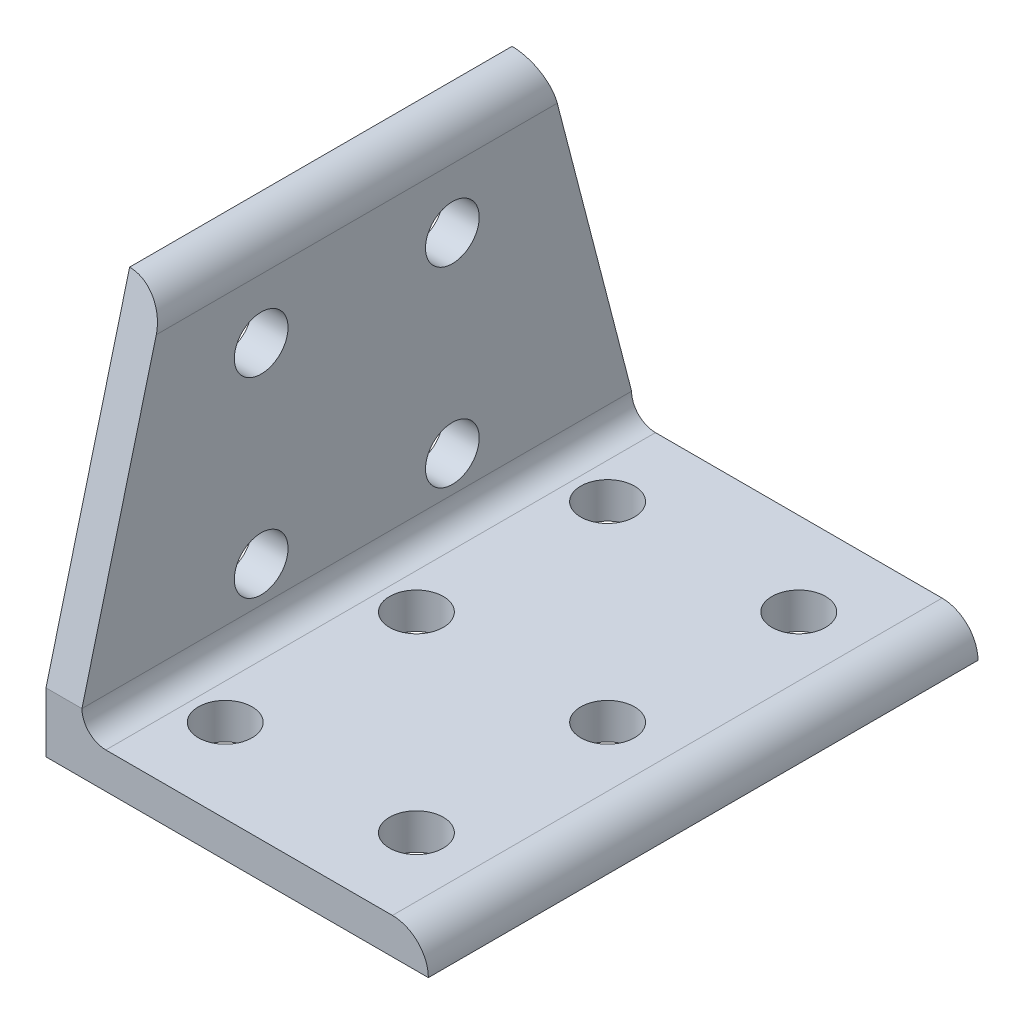
ISO-10303-21;
HEADER;
FILE_DESCRIPTION(('STEP AP214'),'2;1');
FILE_NAME('part.step','',(''),(''),'','','');
FILE_SCHEMA(('AUTOMOTIVE_DESIGN { 1 0 10303 214 1 1 1 1 }'));
ENDSEC;
DATA;
#1=APPLICATION_CONTEXT('core data for automotive mechanical design processes');
#2=APPLICATION_PROTOCOL_DEFINITION('international standard','automotive_design',2000,#1);
#3=PRODUCT_CONTEXT('',#1,'mechanical');
#4=PRODUCT('Part','Part','',(#3));
#5=PRODUCT_RELATED_PRODUCT_CATEGORY('part','',(#4));
#6=PRODUCT_DEFINITION_FORMATION('','',#4);
#7=PRODUCT_DEFINITION_CONTEXT('part definition',#1,'design');
#8=PRODUCT_DEFINITION('design','',#6,#7);
#9=PRODUCT_DEFINITION_SHAPE('','',#8);
#10=(LENGTH_UNIT() NAMED_UNIT(*) SI_UNIT(.MILLI.,.METRE.));
#11=(NAMED_UNIT(*) PLANE_ANGLE_UNIT() SI_UNIT($,.RADIAN.));
#12=(NAMED_UNIT(*) SI_UNIT($,.STERADIAN.) SOLID_ANGLE_UNIT());
#13=UNCERTAINTY_MEASURE_WITH_UNIT(LENGTH_MEASURE(1.E-05),#10,'distance_accuracy_value','');
#14=(GEOMETRIC_REPRESENTATION_CONTEXT(3) GLOBAL_UNCERTAINTY_ASSIGNED_CONTEXT((#13)) GLOBAL_UNIT_ASSIGNED_CONTEXT((#10,
#11,#12)) REPRESENTATION_CONTEXT('',''));
#15=CARTESIAN_POINT('',(0.,0.,0.));
#16=DIRECTION('',(0.,0.,1.));
#17=DIRECTION('',(1.,0.,0.));
#18=AXIS2_PLACEMENT_3D('',#15,#16,#17);
#19=CARTESIAN_POINT('',(-25.4,20.6248,-36.5125));
#20=DIRECTION('',(0.,0.,1.));
#21=DIRECTION('',(1.,0.,0.));
#22=AXIS2_PLACEMENT_3D('',#19,#20,#21);
#23=CYLINDRICAL_SURFACE('',#22,4.7752);
#24=CARTESIAN_POINT('',(-25.4,20.6248,26.6383817427386));
#25=DIRECTION('',(0.,-0.251031853352168,-0.967978826525961));
#26=DIRECTION('',(0.,-0.967978826525961,0.251031853352168));
#27=AXIS2_PLACEMENT_3D('',#24,#25,#26);
#28=ELLIPSE('',#27,4.93316575646392,4.7752);
#29=CARTESIAN_POINT('',(-20.6248,20.6248,26.6383817427386));
#30=VERTEX_POINT('',#29);
#31=CARTESIAN_POINT('',(-25.4,25.4,25.4));
#32=VERTEX_POINT('',#31);
#33=EDGE_CURVE('E128',#30,#32,#28,.F.);
#34=ORIENTED_EDGE('',*,*,#33,.F.);
#35=DIRECTION('',(0.,0.,1.));
#36=VECTOR('',#35,1.);
#37=CARTESIAN_POINT('',(-20.6248,20.6248,-36.5125));
#38=LINE('',#37,#36);
#39=CARTESIAN_POINT('',(-20.6248,20.6248,-26.6383817427386));
#40=VERTEX_POINT('',#39);
#41=EDGE_CURVE('E11',#40,#30,#38,.T.);
#42=ORIENTED_EDGE('',*,*,#41,.F.);
#43=CARTESIAN_POINT('',(-25.4,20.6248,-26.6383817427386));
#44=DIRECTION('',(0.,-0.251031853352169,0.967978826525961));
#45=DIRECTION('',(0.,0.967978826525961,0.251031853352169));
#46=AXIS2_PLACEMENT_3D('',#43,#44,#45);
#47=ELLIPSE('',#46,4.93316575646392,4.7752);
#48=CARTESIAN_POINT('',(-25.4,25.4,-25.4));
#49=VERTEX_POINT('',#48);
#50=EDGE_CURVE('E149',#49,#40,#47,.F.);
#51=ORIENTED_EDGE('',*,*,#50,.F.);
#52=DIRECTION('',(0.,0.,1.));
#53=VECTOR('',#52,1.);
#54=CARTESIAN_POINT('',(-25.4,25.4,-36.5125));
#55=LINE('',#54,#53);
#56=EDGE_CURVE('E50',#49,#32,#55,.T.);
#57=ORIENTED_EDGE('',*,*,#56,.T.);
#58=EDGE_LOOP('',(#34,#42,#51,#57));
#59=FACE_BOUND('',#58,.T.);
#60=ADVANCED_FACE('F47',(#59),#23,.T.);
#61=CARTESIAN_POINT('',(-20.6248,20.6248,-36.5125));
#62=DIRECTION('',(1.,0.,0.));
#63=DIRECTION('',(0.,1.,0.));
#64=AXIS2_PLACEMENT_3D('',#61,#62,#63);
#65=PLANE('',#64);
#66=CARTESIAN_POINT('',(-20.6248,12.6999999999999,-12.7));
#67=DIRECTION('',(1.,0.,0.));
#68=DIRECTION('',(0.,1.,0.));
#69=AXIS2_PLACEMENT_3D('',#66,#67,#68);
#70=CIRCLE('',#69,3.5687);
#71=CARTESIAN_POINT('',(-20.6248,16.2686999999999,-12.7));
#72=VERTEX_POINT('',#71);
#73=EDGE_CURVE('E370',#72,#72,#70,.T.);
#74=ORIENTED_EDGE('',*,*,#73,.F.);
#75=EDGE_LOOP('',(#74));
#76=FACE_BOUND('',#75,.T.);
#77=CARTESIAN_POINT('',(-20.6248,-12.6999999999999,-12.7));
#78=DIRECTION('',(1.,0.,0.));
#79=DIRECTION('',(0.,1.,0.));
#80=AXIS2_PLACEMENT_3D('',#77,#78,#79);
#81=CIRCLE('',#80,3.5687);
#82=CARTESIAN_POINT('',(-20.6248,-9.13129999999987,-12.7));
#83=VERTEX_POINT('',#82);
#84=EDGE_CURVE('E367',#83,#83,#81,.T.);
#85=ORIENTED_EDGE('',*,*,#84,.F.);
#86=EDGE_LOOP('',(#85));
#87=FACE_BOUND('',#86,.T.);
#88=CARTESIAN_POINT('',(-20.6248,-12.6999999999999,12.7));
#89=DIRECTION('',(1.,0.,0.));
#90=DIRECTION('',(0.,1.,0.));
#91=AXIS2_PLACEMENT_3D('',#88,#89,#90);
#92=CIRCLE('',#91,3.5687);
#93=CARTESIAN_POINT('',(-20.6248,-9.13129999999987,12.7));
#94=VERTEX_POINT('',#93);
#95=EDGE_CURVE('E303',#94,#94,#92,.T.);
#96=ORIENTED_EDGE('',*,*,#95,.F.);
#97=EDGE_LOOP('',(#96));
#98=FACE_BOUND('',#97,.T.);
#99=CARTESIAN_POINT('',(-20.6248,12.6999999999999,12.7));
#100=DIRECTION('',(1.,0.,0.));
#101=DIRECTION('',(0.,1.,0.));
#102=AXIS2_PLACEMENT_3D('',#99,#100,#101);
#103=CIRCLE('',#102,3.5687);
#104=CARTESIAN_POINT('',(-20.6248,16.2686999999999,12.7));
#105=VERTEX_POINT('',#104);
#106=EDGE_CURVE('E299',#105,#105,#103,.T.);
#107=ORIENTED_EDGE('',*,*,#106,.F.);
#108=EDGE_LOOP('',(#107));
#109=FACE_BOUND('',#108,.T.);
#110=DIRECTION('',(0.,0.967978826525961,-0.251031853352168));
#111=VECTOR('',#110,1.);
#112=CARTESIAN_POINT('',(-20.6248,35.9700549717886,22.6588031712167));
#113=LINE('',#112,#111);
#114=CARTESIAN_POINT('',(-20.6248,-17.4498,36.5125));
#115=VERTEX_POINT('',#114);
#116=EDGE_CURVE('E131',#115,#30,#113,.T.);
#117=ORIENTED_EDGE('',*,*,#116,.F.);
#118=DIRECTION('',(0.,0.,1.));
#119=VECTOR('',#118,1.);
#120=CARTESIAN_POINT('',(-20.6248,-17.4498,-36.5125));
#121=LINE('',#120,#119);
#122=CARTESIAN_POINT('',(-20.6248,-17.4498,-36.5125));
#123=VERTEX_POINT('',#122);
#124=EDGE_CURVE('E56',#123,#115,#121,.T.);
#125=ORIENTED_EDGE('',*,*,#124,.F.);
#126=DIRECTION('',(0.,-0.967978826525961,-0.251031853352169));
#127=VECTOR('',#126,1.);
#128=CARTESIAN_POINT('',(-20.6248,18.2254532593396,-27.2606189680136));
#129=LINE('',#128,#127);
#130=EDGE_CURVE('E76',#40,#123,#129,.T.);
#131=ORIENTED_EDGE('',*,*,#130,.F.);
#132=ORIENTED_EDGE('',*,*,#41,.T.);
#133=EDGE_LOOP('',(#117,#125,#131,#132));
#134=FACE_BOUND('',#133,.T.);
#135=ADVANCED_FACE('F234',(#76,#87,#98,#109,#134),#65,.T.);
#136=CARTESIAN_POINT('',(-17.4498,-17.4498,-36.5125));
#137=DIRECTION('',(0.,0.,1.));
#138=DIRECTION('',(1.,0.,0.));
#139=AXIS2_PLACEMENT_3D('',#136,#137,#138);
#140=CYLINDRICAL_SURFACE('',#139,3.175);
#141=ORIENTED_EDGE('',*,*,#124,.T.);
#142=CARTESIAN_POINT('',(-17.4498,-17.4498,36.5125));
#143=DIRECTION('',(0.,0.,-1.));
#144=DIRECTION('',(1.,0.,0.));
#145=AXIS2_PLACEMENT_3D('',#142,#143,#144);
#146=CIRCLE('',#145,3.175);
#147=CARTESIAN_POINT('',(-17.4498,-20.6248,36.5125));
#148=VERTEX_POINT('',#147);
#149=EDGE_CURVE('E213',#148,#115,#146,.T.);
#150=ORIENTED_EDGE('',*,*,#149,.F.);
#151=DIRECTION('',(0.,0.,1.));
#152=VECTOR('',#151,1.);
#153=CARTESIAN_POINT('',(-17.4498,-20.6248,-36.5125));
#154=LINE('',#153,#152);
#155=CARTESIAN_POINT('',(-17.4498,-20.6248,-36.5125));
#156=VERTEX_POINT('',#155);
#157=EDGE_CURVE('E176',#156,#148,#154,.T.);
#158=ORIENTED_EDGE('',*,*,#157,.F.);
#159=CARTESIAN_POINT('',(-17.4498,-17.4498,-36.5125));
#160=DIRECTION('',(0.,0.,-1.));
#161=DIRECTION('',(1.,0.,0.));
#162=AXIS2_PLACEMENT_3D('',#159,#160,#161);
#163=CIRCLE('',#162,3.175);
#164=EDGE_CURVE('E152',#156,#123,#163,.T.);
#165=ORIENTED_EDGE('',*,*,#164,.T.);
#166=EDGE_LOOP('',(#141,#150,#158,#165));
#167=FACE_BOUND('',#166,.T.);
#168=ADVANCED_FACE('F231',(#167),#140,.F.);
#169=CARTESIAN_POINT('',(-17.4498,-20.6248,-36.5125));
#170=DIRECTION('',(0.,1.,0.));
#171=DIRECTION('',(-1.,0.,0.));
#172=AXIS2_PLACEMENT_3D('',#169,#170,#171);
#173=PLANE('',#172);
#174=CARTESIAN_POINT('',(-12.7,-20.6248,-25.4));
#175=DIRECTION('',(0.,1.,0.));
#176=DIRECTION('',(-1.,0.,0.));
#177=AXIS2_PLACEMENT_3D('',#174,#175,#176);
#178=CIRCLE('',#177,3.5687);
#179=CARTESIAN_POINT('',(-16.2687,-20.6248,-25.4));
#180=VERTEX_POINT('',#179);
#181=EDGE_CURVE('E278',#180,#180,#178,.T.);
#182=ORIENTED_EDGE('',*,*,#181,.F.);
#183=EDGE_LOOP('',(#182));
#184=FACE_BOUND('',#183,.T.);
#185=CARTESIAN_POINT('',(-12.7,-20.6248,25.4));
#186=DIRECTION('',(0.,1.,0.));
#187=DIRECTION('',(-1.,0.,0.));
#188=AXIS2_PLACEMENT_3D('',#185,#186,#187);
#189=CIRCLE('',#188,3.5687);
#190=CARTESIAN_POINT('',(-16.2687,-20.6248,25.4));
#191=VERTEX_POINT('',#190);
#192=EDGE_CURVE('E279',#191,#191,#189,.T.);
#193=ORIENTED_EDGE('',*,*,#192,.F.);
#194=EDGE_LOOP('',(#193));
#195=FACE_BOUND('',#194,.T.);
#196=CARTESIAN_POINT('',(12.7,-20.6248,25.4));
#197=DIRECTION('',(0.,1.,0.));
#198=DIRECTION('',(1.,0.,0.));
#199=AXIS2_PLACEMENT_3D('',#196,#197,#198);
#200=CIRCLE('',#199,3.5687);
#201=CARTESIAN_POINT('',(16.2687,-20.6248,25.4));
#202=VERTEX_POINT('',#201);
#203=EDGE_CURVE('E351',#202,#202,#200,.T.);
#204=ORIENTED_EDGE('',*,*,#203,.F.);
#205=EDGE_LOOP('',(#204));
#206=FACE_BOUND('',#205,.T.);
#207=CARTESIAN_POINT('',(12.7,-20.6248,-25.4));
#208=DIRECTION('',(0.,1.,0.));
#209=DIRECTION('',(1.,0.,0.));
#210=AXIS2_PLACEMENT_3D('',#207,#208,#209);
#211=CIRCLE('',#210,3.5687);
#212=CARTESIAN_POINT('',(16.2687,-20.6248,-25.4));
#213=VERTEX_POINT('',#212);
#214=EDGE_CURVE('E358',#213,#213,#211,.T.);
#215=ORIENTED_EDGE('',*,*,#214,.F.);
#216=EDGE_LOOP('',(#215));
#217=FACE_BOUND('',#216,.T.);
#218=CARTESIAN_POINT('',(12.7,-20.6248,0.));
#219=DIRECTION('',(0.,1.,0.));
#220=DIRECTION('',(1.,0.,0.));
#221=AXIS2_PLACEMENT_3D('',#218,#219,#220);
#222=CIRCLE('',#221,3.5687);
#223=CARTESIAN_POINT('',(16.2687,-20.6248,0.));
#224=VERTEX_POINT('',#223);
#225=EDGE_CURVE('E487',#224,#224,#222,.T.);
#226=ORIENTED_EDGE('',*,*,#225,.F.);
#227=EDGE_LOOP('',(#226));
#228=FACE_BOUND('',#227,.T.);
#229=CARTESIAN_POINT('',(-12.7,-20.6248,0.));
#230=DIRECTION('',(0.,1.,0.));
#231=DIRECTION('',(-1.,0.,0.));
#232=AXIS2_PLACEMENT_3D('',#229,#230,#231);
#233=CIRCLE('',#232,3.5687);
#234=CARTESIAN_POINT('',(-16.2687,-20.6248,0.));
#235=VERTEX_POINT('',#234);
#236=EDGE_CURVE('E330',#235,#235,#233,.T.);
#237=ORIENTED_EDGE('',*,*,#236,.F.);
#238=EDGE_LOOP('',(#237));
#239=FACE_BOUND('',#238,.T.);
#240=ORIENTED_EDGE('',*,*,#157,.T.);
#241=DIRECTION('',(-1.,0.,0.));
#242=VECTOR('',#241,1.);
#243=CARTESIAN_POINT('',(-17.4498,-20.6248,36.5125));
#244=LINE('',#243,#242);
#245=CARTESIAN_POINT('',(20.6248,-20.6248,36.5125));
#246=VERTEX_POINT('',#245);
#247=EDGE_CURVE('E208',#246,#148,#244,.T.);
#248=ORIENTED_EDGE('',*,*,#247,.F.);
#249=DIRECTION('',(0.,0.,1.));
#250=VECTOR('',#249,1.);
#251=CARTESIAN_POINT('',(20.6248,-20.6248,-36.5125));
#252=LINE('',#251,#250);
#253=CARTESIAN_POINT('',(20.6248,-20.6248,-36.5125));
#254=VERTEX_POINT('',#253);
#255=EDGE_CURVE('E179',#254,#246,#252,.T.);
#256=ORIENTED_EDGE('',*,*,#255,.F.);
#257=DIRECTION('',(-1.,0.,0.));
#258=VECTOR('',#257,1.);
#259=CARTESIAN_POINT('',(-17.4498,-20.6248,-36.5125));
#260=LINE('',#259,#258);
#261=EDGE_CURVE('E160',#254,#156,#260,.T.);
#262=ORIENTED_EDGE('',*,*,#261,.T.);
#263=EDGE_LOOP('',(#240,#248,#256,#262));
#264=FACE_BOUND('',#263,.T.);
#265=ADVANCED_FACE('F229',(#184,#195,#206,#217,#228,#239,#264),#173,.T.);
#266=CARTESIAN_POINT('',(20.6248,-25.4,-36.5125));
#267=DIRECTION('',(0.,0.,1.));
#268=DIRECTION('',(1.,0.,0.));
#269=AXIS2_PLACEMENT_3D('',#266,#267,#268);
#270=CYLINDRICAL_SURFACE('',#269,4.7752);
#271=ORIENTED_EDGE('',*,*,#255,.T.);
#272=CARTESIAN_POINT('',(20.6248,-25.4,36.5125));
#273=DIRECTION('',(0.,0.,1.));
#274=DIRECTION('',(-1.,0.,0.));
#275=AXIS2_PLACEMENT_3D('',#272,#273,#274);
#276=CIRCLE('',#275,4.7752);
#277=CARTESIAN_POINT('',(25.4,-25.4,36.5125));
#278=VERTEX_POINT('',#277);
#279=EDGE_CURVE('E203',#278,#246,#276,.T.);
#280=ORIENTED_EDGE('',*,*,#279,.F.);
#281=DIRECTION('',(0.,0.,1.));
#282=VECTOR('',#281,1.);
#283=CARTESIAN_POINT('',(25.4,-25.4,-36.5125));
#284=LINE('',#283,#282);
#285=CARTESIAN_POINT('',(25.4,-25.4,-36.5125));
#286=VERTEX_POINT('',#285);
#287=EDGE_CURVE('E157',#286,#278,#284,.T.);
#288=ORIENTED_EDGE('',*,*,#287,.F.);
#289=CARTESIAN_POINT('',(20.6248,-25.4,-36.5125));
#290=DIRECTION('',(0.,0.,1.));
#291=DIRECTION('',(-1.,0.,0.));
#292=AXIS2_PLACEMENT_3D('',#289,#290,#291);
#293=CIRCLE('',#292,4.7752);
#294=EDGE_CURVE('E170',#286,#254,#293,.T.);
#295=ORIENTED_EDGE('',*,*,#294,.T.);
#296=EDGE_LOOP('',(#271,#280,#288,#295));
#297=FACE_BOUND('',#296,.T.);
#298=ADVANCED_FACE('F206',(#297),#270,.T.);
#299=CARTESIAN_POINT('',(-25.4,-25.4,-36.5125));
#300=DIRECTION('',(0.,-1.,0.));
#301=DIRECTION('',(1.,0.,0.));
#302=AXIS2_PLACEMENT_3D('',#299,#300,#301);
#303=PLANE('',#302);
#304=CARTESIAN_POINT('',(-12.7,-25.4,-25.4));
#305=DIRECTION('',(0.,1.,0.));
#306=DIRECTION('',(-1.,0.,0.));
#307=AXIS2_PLACEMENT_3D('',#304,#305,#306);
#308=CIRCLE('',#307,3.5687);
#309=CARTESIAN_POINT('',(-16.2687,-25.4,-25.4));
#310=VERTEX_POINT('',#309);
#311=EDGE_CURVE('E336',#310,#310,#308,.T.);
#312=ORIENTED_EDGE('',*,*,#311,.T.);
#313=EDGE_LOOP('',(#312));
#314=FACE_BOUND('',#313,.T.);
#315=CARTESIAN_POINT('',(-12.7,-25.4,25.4));
#316=DIRECTION('',(0.,1.,0.));
#317=DIRECTION('',(-1.,0.,0.));
#318=AXIS2_PLACEMENT_3D('',#315,#316,#317);
#319=CIRCLE('',#318,3.5687);
#320=CARTESIAN_POINT('',(-16.2687,-25.4,25.4));
#321=VERTEX_POINT('',#320);
#322=EDGE_CURVE('E275',#321,#321,#319,.T.);
#323=ORIENTED_EDGE('',*,*,#322,.T.);
#324=EDGE_LOOP('',(#323));
#325=FACE_BOUND('',#324,.T.);
#326=CARTESIAN_POINT('',(12.7,-25.4,25.4));
#327=DIRECTION('',(0.,1.,0.));
#328=DIRECTION('',(1.,0.,0.));
#329=AXIS2_PLACEMENT_3D('',#326,#327,#328);
#330=CIRCLE('',#329,3.5687);
#331=CARTESIAN_POINT('',(16.2687,-25.4,25.4));
#332=VERTEX_POINT('',#331);
#333=EDGE_CURVE('E289',#332,#332,#330,.T.);
#334=ORIENTED_EDGE('',*,*,#333,.T.);
#335=EDGE_LOOP('',(#334));
#336=FACE_BOUND('',#335,.T.);
#337=CARTESIAN_POINT('',(12.7,-25.4,-25.4));
#338=DIRECTION('',(0.,1.,0.));
#339=DIRECTION('',(1.,0.,0.));
#340=AXIS2_PLACEMENT_3D('',#337,#338,#339);
#341=CIRCLE('',#340,3.5687);
#342=CARTESIAN_POINT('',(16.2687,-25.4,-25.4));
#343=VERTEX_POINT('',#342);
#344=EDGE_CURVE('E355',#343,#343,#341,.T.);
#345=ORIENTED_EDGE('',*,*,#344,.T.);
#346=EDGE_LOOP('',(#345));
#347=FACE_BOUND('',#346,.T.);
#348=CARTESIAN_POINT('',(12.7,-25.4,0.));
#349=DIRECTION('',(0.,1.,0.));
#350=DIRECTION('',(1.,0.,0.));
#351=AXIS2_PLACEMENT_3D('',#348,#349,#350);
#352=CIRCLE('',#351,3.5687);
#353=CARTESIAN_POINT('',(16.2687,-25.4,0.));
#354=VERTEX_POINT('',#353);
#355=EDGE_CURVE('E361',#354,#354,#352,.T.);
#356=ORIENTED_EDGE('',*,*,#355,.T.);
#357=EDGE_LOOP('',(#356));
#358=FACE_BOUND('',#357,.T.);
#359=CARTESIAN_POINT('',(-12.7,-25.4,0.));
#360=DIRECTION('',(0.,1.,0.));
#361=DIRECTION('',(-1.,0.,0.));
#362=AXIS2_PLACEMENT_3D('',#359,#360,#361);
#363=CIRCLE('',#362,3.5687);
#364=CARTESIAN_POINT('',(-16.2687,-25.4,0.));
#365=VERTEX_POINT('',#364);
#366=EDGE_CURVE('E323',#365,#365,#363,.T.);
#367=ORIENTED_EDGE('',*,*,#366,.T.);
#368=EDGE_LOOP('',(#367));
#369=FACE_BOUND('',#368,.T.);
#370=ORIENTED_EDGE('',*,*,#287,.T.);
#371=DIRECTION('',(1.,0.,0.));
#372=VECTOR('',#371,1.);
#373=CARTESIAN_POINT('',(-25.4,-25.4,36.5125));
#374=LINE('',#373,#372);
#375=CARTESIAN_POINT('',(-25.4,-25.4,36.5125));
#376=VERTEX_POINT('',#375);
#377=EDGE_CURVE('E192',#376,#278,#374,.T.);
#378=ORIENTED_EDGE('',*,*,#377,.F.);
#379=DIRECTION('',(0.,0.,1.));
#380=VECTOR('',#379,1.);
#381=CARTESIAN_POINT('',(-25.4,-25.4,-36.5125));
#382=LINE('',#381,#380);
#383=CARTESIAN_POINT('',(-25.4,-25.4,-36.5125));
#384=VERTEX_POINT('',#383);
#385=EDGE_CURVE('E151',#384,#376,#382,.T.);
#386=ORIENTED_EDGE('',*,*,#385,.F.);
#387=DIRECTION('',(1.,0.,0.));
#388=VECTOR('',#387,1.);
#389=CARTESIAN_POINT('',(-25.4,-25.4,-36.5125));
#390=LINE('',#389,#388);
#391=EDGE_CURVE('E194',#384,#286,#390,.T.);
#392=ORIENTED_EDGE('',*,*,#391,.T.);
#393=EDGE_LOOP('',(#370,#378,#386,#392));
#394=FACE_BOUND('',#393,.T.);
#395=ADVANCED_FACE('F190',(#314,#325,#336,#347,#358,#369,#394),#303,.T.);
#396=CARTESIAN_POINT('',(-25.4,25.4,-36.5125));
#397=DIRECTION('',(-1.,0.,0.));
#398=DIRECTION('',(0.,-1.,0.));
#399=AXIS2_PLACEMENT_3D('',#396,#397,#398);
#400=PLANE('',#399);
#401=CARTESIAN_POINT('',(-25.4,12.6999999999999,-12.7));
#402=DIRECTION('',(1.,0.,0.));
#403=DIRECTION('',(0.,-1.,0.));
#404=AXIS2_PLACEMENT_3D('',#401,#402,#403);
#405=CIRCLE('',#404,3.5687);
#406=CARTESIAN_POINT('',(-25.4,9.13129999999986,-12.7));
#407=VERTEX_POINT('',#406);
#408=EDGE_CURVE('E315',#407,#407,#405,.T.);
#409=ORIENTED_EDGE('',*,*,#408,.T.);
#410=EDGE_LOOP('',(#409));
#411=FACE_BOUND('',#410,.T.);
#412=CARTESIAN_POINT('',(-25.4,-12.6999999999999,-12.7));
#413=DIRECTION('',(1.,0.,0.));
#414=DIRECTION('',(0.,1.,0.));
#415=AXIS2_PLACEMENT_3D('',#412,#413,#414);
#416=CIRCLE('',#415,3.5687);
#417=CARTESIAN_POINT('',(-25.4,-9.13129999999987,-12.7));
#418=VERTEX_POINT('',#417);
#419=EDGE_CURVE('E310',#418,#418,#416,.T.);
#420=ORIENTED_EDGE('',*,*,#419,.T.);
#421=EDGE_LOOP('',(#420));
#422=FACE_BOUND('',#421,.T.);
#423=CARTESIAN_POINT('',(-25.4,-12.6999999999999,12.7));
#424=DIRECTION('',(1.,0.,0.));
#425=DIRECTION('',(0.,-1.,0.));
#426=AXIS2_PLACEMENT_3D('',#423,#424,#425);
#427=CIRCLE('',#426,3.5687);
#428=CARTESIAN_POINT('',(-25.4,-16.2686999999999,12.7));
#429=VERTEX_POINT('',#428);
#430=EDGE_CURVE('E307',#429,#429,#427,.T.);
#431=ORIENTED_EDGE('',*,*,#430,.T.);
#432=EDGE_LOOP('',(#431));
#433=FACE_BOUND('',#432,.T.);
#434=CARTESIAN_POINT('',(-25.4,12.6999999999999,12.7));
#435=DIRECTION('',(1.,0.,0.));
#436=DIRECTION('',(0.,1.,0.));
#437=AXIS2_PLACEMENT_3D('',#434,#435,#436);
#438=CIRCLE('',#437,3.5687);
#439=CARTESIAN_POINT('',(-25.4,16.2686999999999,12.7));
#440=VERTEX_POINT('',#439);
#441=EDGE_CURVE('E297',#440,#440,#438,.T.);
#442=ORIENTED_EDGE('',*,*,#441,.T.);
#443=EDGE_LOOP('',(#442));
#444=FACE_BOUND('',#443,.T.);
#445=DIRECTION('',(0.,0.96797882652596,-0.251031853352168));
#446=VECTOR('',#445,1.);
#447=CARTESIAN_POINT('',(-25.4,-17.4498,36.5125));
#448=LINE('',#447,#446);
#449=CARTESIAN_POINT('',(-25.4,-17.4498,36.5125));
#450=VERTEX_POINT('',#449);
#451=EDGE_CURVE('E66',#450,#32,#448,.T.);
#452=ORIENTED_EDGE('',*,*,#451,.T.);
#453=ORIENTED_EDGE('',*,*,#56,.F.);
#454=DIRECTION('',(0.,-0.96797882652596,-0.251031853352168));
#455=VECTOR('',#454,1.);
#456=CARTESIAN_POINT('',(-25.4,-17.4498,-36.5125));
#457=LINE('',#456,#455);
#458=CARTESIAN_POINT('',(-25.4,-17.4498,-36.5125));
#459=VERTEX_POINT('',#458);
#460=EDGE_CURVE('E373',#49,#459,#457,.T.);
#461=ORIENTED_EDGE('',*,*,#460,.T.);
#462=DIRECTION('',(0.,-1.,0.));
#463=VECTOR('',#462,1.);
#464=CARTESIAN_POINT('',(-25.4,25.4,-36.5125));
#465=LINE('',#464,#463);
#466=EDGE_CURVE('E219',#459,#384,#465,.T.);
#467=ORIENTED_EDGE('',*,*,#466,.T.);
#468=ORIENTED_EDGE('',*,*,#385,.T.);
#469=DIRECTION('',(0.,-1.,0.));
#470=VECTOR('',#469,1.);
#471=CARTESIAN_POINT('',(-25.4,25.4,36.5125));
#472=LINE('',#471,#470);
#473=EDGE_CURVE('E143',#450,#376,#472,.T.);
#474=ORIENTED_EDGE('',*,*,#473,.F.);
#475=EDGE_LOOP('',(#452,#453,#461,#467,#468,#474));
#476=FACE_BOUND('',#475,.T.);
#477=ADVANCED_FACE('F140',(#411,#422,#433,#444,#476),#400,.T.);
#478=CARTESIAN_POINT('',(-25.4,20.6248,-36.5125));
#479=DIRECTION('',(0.,0.,1.));
#480=DIRECTION('',(1.,0.,0.));
#481=AXIS2_PLACEMENT_3D('',#478,#479,#480);
#482=PLANE('',#481);
#483=ORIENTED_EDGE('',*,*,#466,.F.);
#484=DIRECTION('',(1.,0.,0.));
#485=VECTOR('',#484,1.);
#486=CARTESIAN_POINT('',(-25.4,-17.4498,-36.5125));
#487=LINE('',#486,#485);
#488=EDGE_CURVE('E146',#459,#123,#487,.T.);
#489=ORIENTED_EDGE('',*,*,#488,.T.);
#490=ORIENTED_EDGE('',*,*,#164,.F.);
#491=ORIENTED_EDGE('',*,*,#261,.F.);
#492=ORIENTED_EDGE('',*,*,#294,.F.);
#493=ORIENTED_EDGE('',*,*,#391,.F.);
#494=EDGE_LOOP('',(#483,#489,#490,#491,#492,#493));
#495=FACE_BOUND('',#494,.T.);
#496=ADVANCED_FACE('F227',(#495),#482,.F.);
#497=CARTESIAN_POINT('',(-25.4,20.6248,36.5125));
#498=DIRECTION('',(0.,0.,1.));
#499=DIRECTION('',(1.,0.,0.));
#500=AXIS2_PLACEMENT_3D('',#497,#498,#499);
#501=PLANE('',#500);
#502=DIRECTION('',(1.,0.,0.));
#503=VECTOR('',#502,1.);
#504=CARTESIAN_POINT('',(-25.4,-17.4498,36.5125));
#505=LINE('',#504,#503);
#506=EDGE_CURVE('E145',#450,#115,#505,.T.);
#507=ORIENTED_EDGE('',*,*,#506,.F.);
#508=ORIENTED_EDGE('',*,*,#473,.T.);
#509=ORIENTED_EDGE('',*,*,#377,.T.);
#510=ORIENTED_EDGE('',*,*,#279,.T.);
#511=ORIENTED_EDGE('',*,*,#247,.T.);
#512=ORIENTED_EDGE('',*,*,#149,.T.);
#513=EDGE_LOOP('',(#507,#508,#509,#510,#511,#512));
#514=FACE_BOUND('',#513,.T.);
#515=ADVANCED_FACE('F201',(#514),#501,.T.);
#516=CARTESIAN_POINT('',(-25.4,-17.4498,36.5125));
#517=DIRECTION('',(0.,-0.251031853352168,-0.967978826525961));
#518=DIRECTION('',(0.,0.967978826525961,-0.251031853352168));
#519=AXIS2_PLACEMENT_3D('',#516,#517,#518);
#520=PLANE('',#519);
#521=ORIENTED_EDGE('',*,*,#33,.T.);
#522=ORIENTED_EDGE('',*,*,#451,.F.);
#523=ORIENTED_EDGE('',*,*,#506,.T.);
#524=ORIENTED_EDGE('',*,*,#116,.T.);
#525=EDGE_LOOP('',(#521,#522,#523,#524));
#526=FACE_BOUND('',#525,.T.);
#527=ADVANCED_FACE('F129',(#526),#520,.F.);
#528=CARTESIAN_POINT('',(-25.4,-17.4498,-36.5125));
#529=DIRECTION('',(0.,-0.251031853352169,0.967978826525961));
#530=DIRECTION('',(0.,-0.967978826525961,-0.251031853352169));
#531=AXIS2_PLACEMENT_3D('',#528,#529,#530);
#532=PLANE('',#531);
#533=ORIENTED_EDGE('',*,*,#50,.T.);
#534=ORIENTED_EDGE('',*,*,#130,.T.);
#535=ORIENTED_EDGE('',*,*,#488,.F.);
#536=ORIENTED_EDGE('',*,*,#460,.F.);
#537=EDGE_LOOP('',(#533,#534,#535,#536));
#538=FACE_BOUND('',#537,.T.);
#539=ADVANCED_FACE('F377',(#538),#532,.F.);
#540=CARTESIAN_POINT('',(-25.4,12.6999999999999,12.7));
#541=DIRECTION('',(1.,0.,0.));
#542=DIRECTION('',(0.,1.,0.));
#543=AXIS2_PLACEMENT_3D('',#540,#541,#542);
#544=CYLINDRICAL_SURFACE('',#543,3.5687);
#545=ORIENTED_EDGE('',*,*,#106,.T.);
#546=EDGE_LOOP('',(#545));
#547=FACE_BOUND('',#546,.T.);
#548=ORIENTED_EDGE('',*,*,#441,.F.);
#549=EDGE_LOOP('',(#548));
#550=FACE_BOUND('',#549,.T.);
#551=ADVANCED_FACE('F379',(#547,#550),#544,.F.);
#552=CARTESIAN_POINT('',(-25.4,-12.6999999999999,12.7));
#553=DIRECTION('',(1.,0.,0.));
#554=DIRECTION('',(0.,1.,0.));
#555=AXIS2_PLACEMENT_3D('',#552,#553,#554);
#556=CYLINDRICAL_SURFACE('',#555,3.5687);
#557=ORIENTED_EDGE('',*,*,#95,.T.);
#558=EDGE_LOOP('',(#557));
#559=FACE_BOUND('',#558,.T.);
#560=ORIENTED_EDGE('',*,*,#430,.F.);
#561=EDGE_LOOP('',(#560));
#562=FACE_BOUND('',#561,.T.);
#563=ADVANCED_FACE('F386',(#559,#562),#556,.F.);
#564=CARTESIAN_POINT('',(-25.4,-12.6999999999999,-12.7));
#565=DIRECTION('',(1.,0.,0.));
#566=DIRECTION('',(0.,1.,0.));
#567=AXIS2_PLACEMENT_3D('',#564,#565,#566);
#568=CYLINDRICAL_SURFACE('',#567,3.5687);
#569=ORIENTED_EDGE('',*,*,#84,.T.);
#570=EDGE_LOOP('',(#569));
#571=FACE_BOUND('',#570,.T.);
#572=ORIENTED_EDGE('',*,*,#419,.F.);
#573=EDGE_LOOP('',(#572));
#574=FACE_BOUND('',#573,.T.);
#575=ADVANCED_FACE('F426',(#571,#574),#568,.F.);
#576=CARTESIAN_POINT('',(-25.4,12.6999999999999,-12.7));
#577=DIRECTION('',(1.,0.,0.));
#578=DIRECTION('',(0.,1.,0.));
#579=AXIS2_PLACEMENT_3D('',#576,#577,#578);
#580=CYLINDRICAL_SURFACE('',#579,3.5687);
#581=ORIENTED_EDGE('',*,*,#73,.T.);
#582=EDGE_LOOP('',(#581));
#583=FACE_BOUND('',#582,.T.);
#584=ORIENTED_EDGE('',*,*,#408,.F.);
#585=EDGE_LOOP('',(#584));
#586=FACE_BOUND('',#585,.T.);
#587=ADVANCED_FACE('F432',(#583,#586),#580,.F.);
#588=CARTESIAN_POINT('',(-12.7,-25.4,0.));
#589=DIRECTION('',(0.,1.,0.));
#590=DIRECTION('',(-1.,0.,0.));
#591=AXIS2_PLACEMENT_3D('',#588,#589,#590);
#592=CYLINDRICAL_SURFACE('',#591,3.5687);
#593=ORIENTED_EDGE('',*,*,#366,.F.);
#594=EDGE_LOOP('',(#593));
#595=FACE_BOUND('',#594,.T.);
#596=ORIENTED_EDGE('',*,*,#236,.T.);
#597=EDGE_LOOP('',(#596));
#598=FACE_BOUND('',#597,.T.);
#599=ADVANCED_FACE('F436',(#595,#598),#592,.F.);
#600=CARTESIAN_POINT('',(12.7,-25.4,0.));
#601=DIRECTION('',(0.,1.,0.));
#602=DIRECTION('',(-1.,0.,0.));
#603=AXIS2_PLACEMENT_3D('',#600,#601,#602);
#604=CYLINDRICAL_SURFACE('',#603,3.5687);
#605=ORIENTED_EDGE('',*,*,#355,.F.);
#606=EDGE_LOOP('',(#605));
#607=FACE_BOUND('',#606,.T.);
#608=ORIENTED_EDGE('',*,*,#225,.T.);
#609=EDGE_LOOP('',(#608));
#610=FACE_BOUND('',#609,.T.);
#611=ADVANCED_FACE('F445',(#607,#610),#604,.F.);
#612=CARTESIAN_POINT('',(12.7,-25.4,-25.4));
#613=DIRECTION('',(0.,1.,0.));
#614=DIRECTION('',(-1.,0.,0.));
#615=AXIS2_PLACEMENT_3D('',#612,#613,#614);
#616=CYLINDRICAL_SURFACE('',#615,3.5687);
#617=ORIENTED_EDGE('',*,*,#344,.F.);
#618=EDGE_LOOP('',(#617));
#619=FACE_BOUND('',#618,.T.);
#620=ORIENTED_EDGE('',*,*,#214,.T.);
#621=EDGE_LOOP('',(#620));
#622=FACE_BOUND('',#621,.T.);
#623=ADVANCED_FACE('F450',(#619,#622),#616,.F.);
#624=CARTESIAN_POINT('',(12.7,-25.4,25.4));
#625=DIRECTION('',(0.,1.,0.));
#626=DIRECTION('',(-1.,0.,0.));
#627=AXIS2_PLACEMENT_3D('',#624,#625,#626);
#628=CYLINDRICAL_SURFACE('',#627,3.5687);
#629=ORIENTED_EDGE('',*,*,#333,.F.);
#630=EDGE_LOOP('',(#629));
#631=FACE_BOUND('',#630,.T.);
#632=ORIENTED_EDGE('',*,*,#203,.T.);
#633=EDGE_LOOP('',(#632));
#634=FACE_BOUND('',#633,.T.);
#635=ADVANCED_FACE('F461',(#631,#634),#628,.F.);
#636=CARTESIAN_POINT('',(-12.7,-25.4,25.4));
#637=DIRECTION('',(0.,1.,0.));
#638=DIRECTION('',(-1.,0.,0.));
#639=AXIS2_PLACEMENT_3D('',#636,#637,#638);
#640=CYLINDRICAL_SURFACE('',#639,3.5687);
#641=ORIENTED_EDGE('',*,*,#322,.F.);
#642=EDGE_LOOP('',(#641));
#643=FACE_BOUND('',#642,.T.);
#644=ORIENTED_EDGE('',*,*,#192,.T.);
#645=EDGE_LOOP('',(#644));
#646=FACE_BOUND('',#645,.T.);
#647=ADVANCED_FACE('F469',(#643,#646),#640,.F.);
#648=CARTESIAN_POINT('',(-12.7,-25.4,-25.4));
#649=DIRECTION('',(0.,1.,0.));
#650=DIRECTION('',(-1.,0.,0.));
#651=AXIS2_PLACEMENT_3D('',#648,#649,#650);
#652=CYLINDRICAL_SURFACE('',#651,3.5687);
#653=ORIENTED_EDGE('',*,*,#311,.F.);
#654=EDGE_LOOP('',(#653));
#655=FACE_BOUND('',#654,.T.);
#656=ORIENTED_EDGE('',*,*,#181,.T.);
#657=EDGE_LOOP('',(#656));
#658=FACE_BOUND('',#657,.T.);
#659=ADVANCED_FACE('F466',(#655,#658),#652,.F.);
#660=CLOSED_SHELL('',(#60,#135,#168,#265,#298,#395,#477,#496,#515,#527,#539,#551,#563,#575,#587,
#599,#611,#623,#635,#647,#659));
#661=MANIFOLD_SOLID_BREP('B2',#660);
#662=ADVANCED_BREP_SHAPE_REPRESENTATION('',(#18,#661),#14);
#663=SHAPE_DEFINITION_REPRESENTATION(#9,#662);
ENDSEC;
END-ISO-10303-21;
